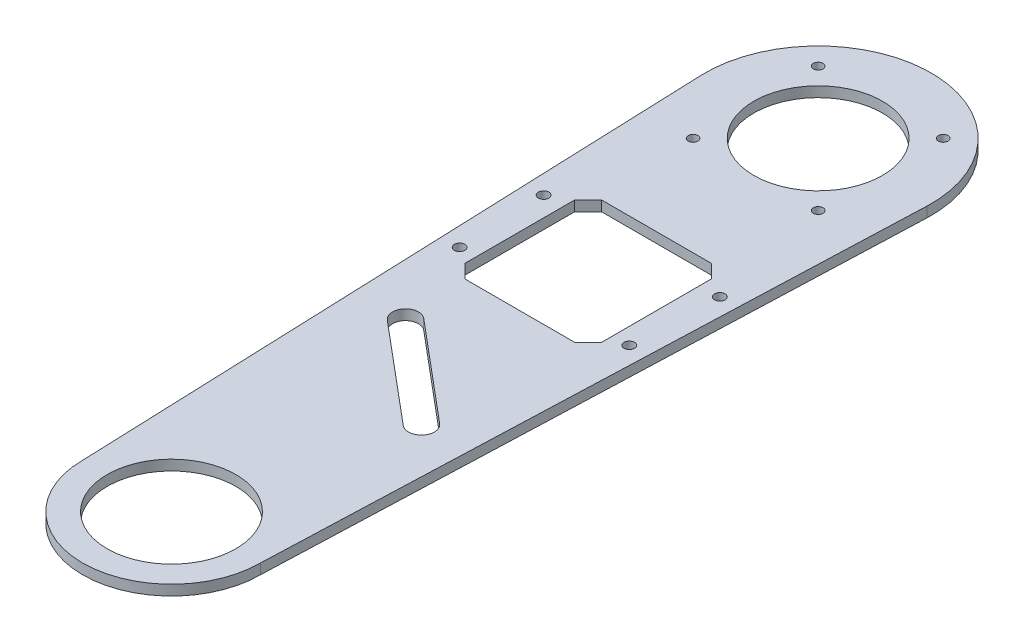
ISO-10303-21;
HEADER;
FILE_DESCRIPTION(('STEP AP214'),'2;1');
FILE_NAME('part.step','',(''),(''),'','','');
FILE_SCHEMA(('AUTOMOTIVE_DESIGN { 1 0 10303 214 1 1 1 1 }'));
ENDSEC;
DATA;
#1=APPLICATION_CONTEXT('core data for automotive mechanical design processes');
#2=APPLICATION_PROTOCOL_DEFINITION('international standard','automotive_design',2000,#1);
#3=PRODUCT_CONTEXT('',#1,'mechanical');
#4=PRODUCT('Part','Part','',(#3));
#5=PRODUCT_RELATED_PRODUCT_CATEGORY('part','',(#4));
#6=PRODUCT_DEFINITION_FORMATION('','',#4);
#7=PRODUCT_DEFINITION_CONTEXT('part definition',#1,'design');
#8=PRODUCT_DEFINITION('design','',#6,#7);
#9=PRODUCT_DEFINITION_SHAPE('','',#8);
#10=(LENGTH_UNIT() NAMED_UNIT(*) SI_UNIT(.MILLI.,.METRE.));
#11=(NAMED_UNIT(*) PLANE_ANGLE_UNIT() SI_UNIT($,.RADIAN.));
#12=(NAMED_UNIT(*) SI_UNIT($,.STERADIAN.) SOLID_ANGLE_UNIT());
#13=UNCERTAINTY_MEASURE_WITH_UNIT(LENGTH_MEASURE(1.E-05),#10,'distance_accuracy_value','');
#14=(GEOMETRIC_REPRESENTATION_CONTEXT(3) GLOBAL_UNCERTAINTY_ASSIGNED_CONTEXT((#13)) GLOBAL_UNIT_ASSIGNED_CONTEXT((#10,
#11,#12)) REPRESENTATION_CONTEXT('',''));
#15=CARTESIAN_POINT('',(0.,0.,0.));
#16=DIRECTION('',(0.,0.,1.));
#17=DIRECTION('',(1.,0.,0.));
#18=AXIS2_PLACEMENT_3D('',#15,#16,#17);
#19=CARTESIAN_POINT('',(31.2181907364059,3.175,1.17454749419578));
#20=DIRECTION('',(-0.999292974733131,0.,-0.0375972159741945));
#21=DIRECTION('',(-0.0375972159741945,0.,0.999292974733131));
#22=AXIS2_PLACEMENT_3D('',#19,#20,#21);
#23=PLANE('',#22);
#24=DIRECTION('',(0.0375972159741945,0.,-0.999292974733131));
#25=VECTOR('',#24,1.);
#26=CARTESIAN_POINT('',(31.2181907364059,0.,1.17454749419578));
#27=LINE('',#26,#25);
#28=CARTESIAN_POINT('',(27.5,0.,100.));
#29=VERTEX_POINT('',#28);
#30=CARTESIAN_POINT('',(34.9752541156596,0.,-98.6840974409032));
#31=VERTEX_POINT('',#30);
#32=EDGE_CURVE('E299',#29,#31,#27,.T.);
#33=ORIENTED_EDGE('',*,*,#32,.T.);
#34=DIRECTION('',(0.,-1.,0.));
#35=VECTOR('',#34,1.);
#36=CARTESIAN_POINT('',(34.9752541156596,3.175,-98.6840974409032));
#37=LINE('',#36,#35);
#38=CARTESIAN_POINT('',(34.9752541156596,3.175,-98.6840974409032));
#39=VERTEX_POINT('',#38);
#40=EDGE_CURVE('E11',#39,#31,#37,.T.);
#41=ORIENTED_EDGE('',*,*,#40,.F.);
#42=DIRECTION('',(0.0375972159741945,0.,-0.999292974733131));
#43=VECTOR('',#42,1.);
#44=CARTESIAN_POINT('',(31.2181907364059,3.175,1.17454749419578));
#45=LINE('',#44,#43);
#46=CARTESIAN_POINT('',(27.5,3.175,100.));
#47=VERTEX_POINT('',#46);
#48=EDGE_CURVE('E308',#47,#39,#45,.T.);
#49=ORIENTED_EDGE('',*,*,#48,.F.);
#50=DIRECTION('',(0.,-1.,0.));
#51=VECTOR('',#50,1.);
#52=CARTESIAN_POINT('',(27.5,3.175,100.));
#53=LINE('',#52,#51);
#54=EDGE_CURVE('E319',#47,#29,#53,.T.);
#55=ORIENTED_EDGE('',*,*,#54,.T.);
#56=EDGE_LOOP('',(#33,#41,#49,#55));
#57=FACE_BOUND('',#56,.T.);
#58=ADVANCED_FACE('F35',(#57),#23,.F.);
#59=CARTESIAN_POINT('',(0.,3.175,-100.));
#60=DIRECTION('',(0.,-1.,0.));
#61=DIRECTION('',(0.,0.,-1.));
#62=AXIS2_PLACEMENT_3D('',#59,#60,#61);
#63=CYLINDRICAL_SURFACE('',#62,35.);
#64=CARTESIAN_POINT('',(0.,0.,-100.));
#65=DIRECTION('',(0.,1.,0.));
#66=DIRECTION('',(0.,0.,1.));
#67=AXIS2_PLACEMENT_3D('',#64,#65,#66);
#68=CIRCLE('',#67,35.);
#69=CARTESIAN_POINT('',(-34.9752541156596,0.,-98.6840974409032));
#70=VERTEX_POINT('',#69);
#71=EDGE_CURVE('E322',#31,#70,#68,.T.);
#72=ORIENTED_EDGE('',*,*,#71,.T.);
#73=DIRECTION('',(0.,-1.,0.));
#74=VECTOR('',#73,1.);
#75=CARTESIAN_POINT('',(-34.9752541156596,3.175,-98.6840974409032));
#76=LINE('',#75,#74);
#77=CARTESIAN_POINT('',(-34.9752541156596,3.175,-98.6840974409032));
#78=VERTEX_POINT('',#77);
#79=EDGE_CURVE('E42',#78,#70,#76,.T.);
#80=ORIENTED_EDGE('',*,*,#79,.F.);
#81=CARTESIAN_POINT('',(0.,3.175,-100.));
#82=DIRECTION('',(0.,1.,0.));
#83=DIRECTION('',(0.,0.,1.));
#84=AXIS2_PLACEMENT_3D('',#81,#82,#83);
#85=CIRCLE('',#84,35.);
#86=EDGE_CURVE('E311',#39,#78,#85,.T.);
#87=ORIENTED_EDGE('',*,*,#86,.F.);
#88=ORIENTED_EDGE('',*,*,#40,.T.);
#89=EDGE_LOOP('',(#72,#80,#87,#88));
#90=FACE_BOUND('',#89,.T.);
#91=ADVANCED_FACE('F338',(#90),#63,.T.);
#92=CARTESIAN_POINT('',(-31.2181907364059,3.175,1.17454749419578));
#93=DIRECTION('',(-0.999292974733131,0.,0.0375972159741945));
#94=DIRECTION('',(0.0375972159741945,0.,0.999292974733131));
#95=AXIS2_PLACEMENT_3D('',#92,#93,#94);
#96=PLANE('',#95);
#97=DIRECTION('',(-0.0375972159741945,0.,-0.999292974733131));
#98=VECTOR('',#97,1.);
#99=CARTESIAN_POINT('',(-31.2181907364059,0.,1.17454749419578));
#100=LINE('',#99,#98);
#101=CARTESIAN_POINT('',(-27.5,0.,100.));
#102=VERTEX_POINT('',#101);
#103=EDGE_CURVE('E325',#102,#70,#100,.T.);
#104=ORIENTED_EDGE('',*,*,#103,.F.);
#105=DIRECTION('',(0.,-1.,0.));
#106=VECTOR('',#105,1.);
#107=CARTESIAN_POINT('',(-27.5,3.175,100.));
#108=LINE('',#107,#106);
#109=CARTESIAN_POINT('',(-27.5,3.175,100.));
#110=VERTEX_POINT('',#109);
#111=EDGE_CURVE('E331',#110,#102,#108,.T.);
#112=ORIENTED_EDGE('',*,*,#111,.F.);
#113=DIRECTION('',(-0.0375972159741945,0.,-0.999292974733131));
#114=VECTOR('',#113,1.);
#115=CARTESIAN_POINT('',(-31.2181907364059,3.175,1.17454749419578));
#116=LINE('',#115,#114);
#117=EDGE_CURVE('E314',#110,#78,#116,.T.);
#118=ORIENTED_EDGE('',*,*,#117,.T.);
#119=ORIENTED_EDGE('',*,*,#79,.T.);
#120=EDGE_LOOP('',(#104,#112,#118,#119));
#121=FACE_BOUND('',#120,.T.);
#122=ADVANCED_FACE('F335',(#121),#96,.T.);
#123=CARTESIAN_POINT('',(0.,3.175,100.));
#124=DIRECTION('',(0.,-1.,0.));
#125=DIRECTION('',(0.,0.,-1.));
#126=AXIS2_PLACEMENT_3D('',#123,#124,#125);
#127=CYLINDRICAL_SURFACE('',#126,27.5);
#128=CARTESIAN_POINT('',(0.,0.,100.));
#129=DIRECTION('',(0.,1.,0.));
#130=DIRECTION('',(0.,0.,1.));
#131=AXIS2_PLACEMENT_3D('',#128,#129,#130);
#132=CIRCLE('',#131,27.5);
#133=EDGE_CURVE('E312',#102,#29,#132,.T.);
#134=ORIENTED_EDGE('',*,*,#133,.T.);
#135=ORIENTED_EDGE('',*,*,#54,.F.);
#136=CARTESIAN_POINT('',(0.,3.175,100.));
#137=DIRECTION('',(0.,1.,0.));
#138=DIRECTION('',(0.,0.,1.));
#139=AXIS2_PLACEMENT_3D('',#136,#137,#138);
#140=CIRCLE('',#139,27.5);
#141=EDGE_CURVE('E317',#110,#47,#140,.T.);
#142=ORIENTED_EDGE('',*,*,#141,.F.);
#143=ORIENTED_EDGE('',*,*,#111,.T.);
#144=EDGE_LOOP('',(#134,#135,#142,#143));
#145=FACE_BOUND('',#144,.T.);
#146=ADVANCED_FACE('F345',(#145),#127,.T.);
#147=CARTESIAN_POINT('',(0.,3.175,0.));
#148=DIRECTION('',(0.,1.,0.));
#149=DIRECTION('',(0.,0.,1.));
#150=AXIS2_PLACEMENT_3D('',#147,#148,#149);
#151=PLANE('',#150);
#152=CARTESIAN_POINT('',(15.3208888623795,3.175,38.0115043874616));
#153=DIRECTION('',(0.,1.,0.));
#154=DIRECTION('',(0.,0.,1.));
#155=AXIS2_PLACEMENT_3D('',#152,#153,#154);
#156=CIRCLE('',#155,3.99999999999999);
#157=CARTESIAN_POINT('',(12.7497384236334,3.175,41.0756821599375));
#158=VERTEX_POINT('',#157);
#159=CARTESIAN_POINT('',(17.8920393011257,3.175,34.9473266149857));
#160=VERTEX_POINT('',#159);
#161=EDGE_CURVE('E49',#158,#160,#156,.T.);
#162=ORIENTED_EDGE('',*,*,#161,.F.);
#163=DIRECTION('',(0.766044443118977,0.,0.642787609686541));
#164=VECTOR('',#163,1.);
#165=CARTESIAN_POINT('',(-17.8920393011257,3.175,15.3641777724759));
#166=LINE('',#165,#164);
#167=CARTESIAN_POINT('',(-17.8920393011257,3.175,15.3641777724759));
#168=VERTEX_POINT('',#167);
#169=EDGE_CURVE('E165',#168,#158,#166,.T.);
#170=ORIENTED_EDGE('',*,*,#169,.F.);
#171=CARTESIAN_POINT('',(-15.3208888623795,3.175,12.2999999999999));
#172=DIRECTION('',(0.,1.,0.));
#173=DIRECTION('',(0.,0.,1.));
#174=AXIS2_PLACEMENT_3D('',#171,#172,#173);
#175=CIRCLE('',#174,3.99999999999999);
#176=CARTESIAN_POINT('',(-12.7497384236334,3.175,9.23582222752405));
#177=VERTEX_POINT('',#176);
#178=EDGE_CURVE('E168',#177,#168,#175,.T.);
#179=ORIENTED_EDGE('',*,*,#178,.F.);
#180=DIRECTION('',(-0.766044443118977,0.,-0.642787609686541));
#181=VECTOR('',#180,1.);
#182=CARTESIAN_POINT('',(17.8920393011257,3.175,34.9473266149857));
#183=LINE('',#182,#181);
#184=EDGE_CURVE('E174',#160,#177,#183,.T.);
#185=ORIENTED_EDGE('',*,*,#184,.F.);
#186=EDGE_LOOP('',(#162,#170,#179,#185));
#187=FACE_BOUND('',#186,.T.);
#188=CARTESIAN_POINT('',(27.2564768235202,3.175,-42.3404551588973));
#189=DIRECTION('',(0.,1.,0.));
#190=DIRECTION('',(0.,0.,1.));
#191=AXIS2_PLACEMENT_3D('',#188,#189,#190);
#192=CIRCLE('',#191,1.62499999999999);
#193=CARTESIAN_POINT('',(27.2564768235202,3.175,-40.7154551588973));
#194=VERTEX_POINT('',#193);
#195=EDGE_CURVE('E180',#194,#194,#192,.T.);
#196=ORIENTED_EDGE('',*,*,#195,.F.);
#197=EDGE_LOOP('',(#196));
#198=FACE_BOUND('',#197,.T.);
#199=CARTESIAN_POINT('',(26.2413519922169,3.175,-15.3595448411027));
#200=DIRECTION('',(0.,1.,0.));
#201=DIRECTION('',(0.,0.,1.));
#202=AXIS2_PLACEMENT_3D('',#199,#200,#201);
#203=CIRCLE('',#202,1.62499999999999);
#204=CARTESIAN_POINT('',(26.2413519922169,3.175,-13.7345448411028));
#205=VERTEX_POINT('',#204);
#206=EDGE_CURVE('E200',#205,#205,#203,.T.);
#207=ORIENTED_EDGE('',*,*,#206,.F.);
#208=EDGE_LOOP('',(#207));
#209=FACE_BOUND('',#208,.T.);
#210=CARTESIAN_POINT('',(-26.2413519922169,3.175,-15.3595448411027));
#211=DIRECTION('',(0.,1.,0.));
#212=DIRECTION('',(0.,0.,1.));
#213=AXIS2_PLACEMENT_3D('',#210,#211,#212);
#214=CIRCLE('',#213,1.62499999999999);
#215=CARTESIAN_POINT('',(-26.2413519922169,3.175,-13.7345448411028));
#216=VERTEX_POINT('',#215);
#217=EDGE_CURVE('E194',#216,#216,#214,.T.);
#218=ORIENTED_EDGE('',*,*,#217,.F.);
#219=EDGE_LOOP('',(#218));
#220=FACE_BOUND('',#219,.T.);
#221=CARTESIAN_POINT('',(-27.2564768235202,3.175,-42.3404551588973));
#222=DIRECTION('',(0.,1.,0.));
#223=DIRECTION('',(0.,0.,1.));
#224=AXIS2_PLACEMENT_3D('',#221,#222,#223);
#225=CIRCLE('',#224,1.625);
#226=CARTESIAN_POINT('',(-27.2564768235202,3.175,-40.7154551588973));
#227=VERTEX_POINT('',#226);
#228=EDGE_CURVE('E188',#227,#227,#225,.T.);
#229=ORIENTED_EDGE('',*,*,#228,.F.);
#230=EDGE_LOOP('',(#229));
#231=FACE_BOUND('',#230,.T.);
#232=DIRECTION('',(0.,0.,1.));
#233=VECTOR('',#232,1.);
#234=CARTESIAN_POINT('',(-21.15,3.175,-11.8719300090006));
#235=LINE('',#234,#233);
#236=CARTESIAN_POINT('',(-21.15,3.175,-45.8280699909994));
#237=VERTEX_POINT('',#236);
#238=CARTESIAN_POINT('',(-21.15,3.175,-11.8719300090006));
#239=VERTEX_POINT('',#238);
#240=EDGE_CURVE('E187',#237,#239,#235,.T.);
#241=ORIENTED_EDGE('',*,*,#240,.F.);
#242=DIRECTION('',(-0.707106781186548,0.,0.707106781186547));
#243=VECTOR('',#242,1.);
#244=CARTESIAN_POINT('',(-21.15,3.175,-45.8280699909994));
#245=LINE('',#244,#243);
#246=CARTESIAN_POINT('',(-16.9780699909994,3.175,-50.));
#247=VERTEX_POINT('',#246);
#248=EDGE_CURVE('E212',#247,#237,#245,.T.);
#249=ORIENTED_EDGE('',*,*,#248,.F.);
#250=DIRECTION('',(-1.,0.,0.));
#251=VECTOR('',#250,1.);
#252=CARTESIAN_POINT('',(-16.9780699909994,3.175,-50.));
#253=LINE('',#252,#251);
#254=CARTESIAN_POINT('',(16.9780699909994,3.175,-50.));
#255=VERTEX_POINT('',#254);
#256=EDGE_CURVE('E250',#255,#247,#253,.T.);
#257=ORIENTED_EDGE('',*,*,#256,.F.);
#258=DIRECTION('',(-0.707106781186548,0.,-0.707106781186547));
#259=VECTOR('',#258,1.);
#260=CARTESIAN_POINT('',(16.9780699909994,3.175,-50.));
#261=LINE('',#260,#259);
#262=CARTESIAN_POINT('',(21.15,3.175,-45.8280699909994));
#263=VERTEX_POINT('',#262);
#264=EDGE_CURVE('E247',#263,#255,#261,.T.);
#265=ORIENTED_EDGE('',*,*,#264,.F.);
#266=DIRECTION('',(0.,0.,-1.));
#267=VECTOR('',#266,1.);
#268=CARTESIAN_POINT('',(21.15,3.175,-45.8280699909994));
#269=LINE('',#268,#267);
#270=CARTESIAN_POINT('',(21.15,3.175,-11.8719300090007));
#271=VERTEX_POINT('',#270);
#272=EDGE_CURVE('E244',#271,#263,#269,.T.);
#273=ORIENTED_EDGE('',*,*,#272,.F.);
#274=DIRECTION('',(0.707106781186547,0.,-0.707106781186548));
#275=VECTOR('',#274,1.);
#276=CARTESIAN_POINT('',(21.15,3.175,-11.8719300090007));
#277=LINE('',#276,#275);
#278=CARTESIAN_POINT('',(16.9780699909994,3.175,-7.70000000000005));
#279=VERTEX_POINT('',#278);
#280=EDGE_CURVE('E241',#279,#271,#277,.T.);
#281=ORIENTED_EDGE('',*,*,#280,.F.);
#282=DIRECTION('',(1.,0.,0.));
#283=VECTOR('',#282,1.);
#284=CARTESIAN_POINT('',(16.9780699909994,3.175,-7.70000000000005));
#285=LINE('',#284,#283);
#286=CARTESIAN_POINT('',(-16.9780699909994,3.175,-7.70000000000005));
#287=VERTEX_POINT('',#286);
#288=EDGE_CURVE('E238',#287,#279,#285,.T.);
#289=ORIENTED_EDGE('',*,*,#288,.F.);
#290=DIRECTION('',(0.707106781186555,0.,0.70710678118654));
#291=VECTOR('',#290,1.);
#292=CARTESIAN_POINT('',(-16.9780699909994,3.175,-7.70000000000005));
#293=LINE('',#292,#291);
#294=EDGE_CURVE('E235',#239,#287,#293,.T.);
#295=ORIENTED_EDGE('',*,*,#294,.F.);
#296=EDGE_LOOP('',(#241,#249,#257,#265,#273,#281,#289,#295));
#297=FACE_BOUND('',#296,.T.);
#298=CARTESIAN_POINT('',(-19.3393704654521,3.175,-80.6606295345479));
#299=DIRECTION('',(0.,1.,0.));
#300=DIRECTION('',(0.,0.,1.));
#301=AXIS2_PLACEMENT_3D('',#298,#299,#300);
#302=CIRCLE('',#301,1.5);
#303=CARTESIAN_POINT('',(-19.3393704654521,3.175,-79.1606295345479));
#304=VERTEX_POINT('',#303);
#305=EDGE_CURVE('E257',#304,#304,#302,.T.);
#306=ORIENTED_EDGE('',*,*,#305,.F.);
#307=EDGE_LOOP('',(#306));
#308=FACE_BOUND('',#307,.T.);
#309=CARTESIAN_POINT('',(-19.3393704654521,3.175,-119.339370465452));
#310=DIRECTION('',(0.,1.,0.));
#311=DIRECTION('',(0.,0.,1.));
#312=AXIS2_PLACEMENT_3D('',#309,#310,#311);
#313=CIRCLE('',#312,1.5);
#314=CARTESIAN_POINT('',(-19.3393704654521,3.175,-117.839370465452));
#315=VERTEX_POINT('',#314);
#316=EDGE_CURVE('E282',#315,#315,#313,.T.);
#317=ORIENTED_EDGE('',*,*,#316,.F.);
#318=EDGE_LOOP('',(#317));
#319=FACE_BOUND('',#318,.T.);
#320=CARTESIAN_POINT('',(19.3393704654521,3.175,-119.339370465452));
#321=DIRECTION('',(0.,1.,0.));
#322=DIRECTION('',(0.,0.,1.));
#323=AXIS2_PLACEMENT_3D('',#320,#321,#322);
#324=CIRCLE('',#323,1.5);
#325=CARTESIAN_POINT('',(19.3393704654521,3.175,-117.839370465452));
#326=VERTEX_POINT('',#325);
#327=EDGE_CURVE('E276',#326,#326,#324,.T.);
#328=ORIENTED_EDGE('',*,*,#327,.F.);
#329=EDGE_LOOP('',(#328));
#330=FACE_BOUND('',#329,.T.);
#331=CARTESIAN_POINT('',(19.3393704654521,3.175,-80.6606295345479));
#332=DIRECTION('',(0.,1.,0.));
#333=DIRECTION('',(0.,0.,1.));
#334=AXIS2_PLACEMENT_3D('',#331,#332,#333);
#335=CIRCLE('',#334,1.5);
#336=CARTESIAN_POINT('',(19.3393704654521,3.175,-79.1606295345479));
#337=VERTEX_POINT('',#336);
#338=EDGE_CURVE('E275',#337,#337,#335,.T.);
#339=ORIENTED_EDGE('',*,*,#338,.F.);
#340=EDGE_LOOP('',(#339));
#341=FACE_BOUND('',#340,.T.);
#342=CARTESIAN_POINT('',(0.,3.175,100.));
#343=DIRECTION('',(0.,1.,0.));
#344=DIRECTION('',(0.,0.,1.));
#345=AXIS2_PLACEMENT_3D('',#342,#343,#344);
#346=CIRCLE('',#345,19.9);
#347=CARTESIAN_POINT('',(0.,3.175,119.9));
#348=VERTEX_POINT('',#347);
#349=EDGE_CURVE('E300',#348,#348,#346,.T.);
#350=ORIENTED_EDGE('',*,*,#349,.F.);
#351=EDGE_LOOP('',(#350));
#352=FACE_BOUND('',#351,.T.);
#353=CARTESIAN_POINT('',(0.,3.175,-100.));
#354=DIRECTION('',(0.,1.,0.));
#355=DIRECTION('',(0.,0.,1.));
#356=AXIS2_PLACEMENT_3D('',#353,#354,#355);
#357=CIRCLE('',#356,19.9);
#358=CARTESIAN_POINT('',(0.,3.175,-80.1));
#359=VERTEX_POINT('',#358);
#360=EDGE_CURVE('E293',#359,#359,#357,.T.);
#361=ORIENTED_EDGE('',*,*,#360,.F.);
#362=EDGE_LOOP('',(#361));
#363=FACE_BOUND('',#362,.T.);
#364=ORIENTED_EDGE('',*,*,#48,.T.);
#365=ORIENTED_EDGE('',*,*,#86,.T.);
#366=ORIENTED_EDGE('',*,*,#117,.F.);
#367=ORIENTED_EDGE('',*,*,#141,.T.);
#368=EDGE_LOOP('',(#364,#365,#366,#367));
#369=FACE_BOUND('',#368,.T.);
#370=ADVANCED_FACE('F350',(#187,#198,#209,#220,#231,#297,#308,#319,#330,#341,#352,#363,#369),
#151,.T.);
#371=CARTESIAN_POINT('',(0.,0.,0.));
#372=DIRECTION('',(0.,1.,0.));
#373=DIRECTION('',(0.,0.,1.));
#374=AXIS2_PLACEMENT_3D('',#371,#372,#373);
#375=PLANE('',#374);
#376=DIRECTION('',(0.766044443118977,0.,0.642787609686541));
#377=VECTOR('',#376,1.);
#378=CARTESIAN_POINT('',(-17.8920393011257,0.,15.3641777724759));
#379=LINE('',#378,#377);
#380=CARTESIAN_POINT('',(-17.8920393011257,0.,15.3641777724759));
#381=VERTEX_POINT('',#380);
#382=CARTESIAN_POINT('',(12.7497384236334,0.,41.0756821599375));
#383=VERTEX_POINT('',#382);
#384=EDGE_CURVE('E155',#381,#383,#379,.T.);
#385=ORIENTED_EDGE('',*,*,#384,.T.);
#386=CARTESIAN_POINT('',(15.3208888623795,0.,38.0115043874616));
#387=DIRECTION('',(0.,1.,0.));
#388=DIRECTION('',(0.,0.,1.));
#389=AXIS2_PLACEMENT_3D('',#386,#387,#388);
#390=CIRCLE('',#389,3.99999999999999);
#391=CARTESIAN_POINT('',(17.8920393011257,0.,34.9473266149857));
#392=VERTEX_POINT('',#391);
#393=EDGE_CURVE('E149',#383,#392,#390,.T.);
#394=ORIENTED_EDGE('',*,*,#393,.T.);
#395=DIRECTION('',(-0.766044443118977,0.,-0.642787609686541));
#396=VECTOR('',#395,1.);
#397=CARTESIAN_POINT('',(17.8920393011257,0.,34.9473266149857));
#398=LINE('',#397,#396);
#399=CARTESIAN_POINT('',(-12.7497384236334,0.,9.23582222752404));
#400=VERTEX_POINT('',#399);
#401=EDGE_CURVE('E158',#392,#400,#398,.T.);
#402=ORIENTED_EDGE('',*,*,#401,.T.);
#403=CARTESIAN_POINT('',(-15.3208888623795,0.,12.2999999999999));
#404=DIRECTION('',(0.,1.,0.));
#405=DIRECTION('',(0.,0.,1.));
#406=AXIS2_PLACEMENT_3D('',#403,#404,#405);
#407=CIRCLE('',#406,3.99999999999999);
#408=EDGE_CURVE('E57',#400,#381,#407,.T.);
#409=ORIENTED_EDGE('',*,*,#408,.T.);
#410=EDGE_LOOP('',(#385,#394,#402,#409));
#411=FACE_BOUND('',#410,.T.);
#412=CARTESIAN_POINT('',(27.2564768235202,0.,-42.3404551588973));
#413=DIRECTION('',(0.,1.,0.));
#414=DIRECTION('',(0.,0.,1.));
#415=AXIS2_PLACEMENT_3D('',#412,#413,#414);
#416=CIRCLE('',#415,1.62499999999999);
#417=CARTESIAN_POINT('',(27.2564768235202,0.,-40.7154551588973));
#418=VERTEX_POINT('',#417);
#419=EDGE_CURVE('E203',#418,#418,#416,.T.);
#420=ORIENTED_EDGE('',*,*,#419,.T.);
#421=EDGE_LOOP('',(#420));
#422=FACE_BOUND('',#421,.T.);
#423=CARTESIAN_POINT('',(26.2413519922169,0.,-15.3595448411027));
#424=DIRECTION('',(0.,1.,0.));
#425=DIRECTION('',(0.,0.,1.));
#426=AXIS2_PLACEMENT_3D('',#423,#424,#425);
#427=CIRCLE('',#426,1.62499999999999);
#428=CARTESIAN_POINT('',(26.2413519922169,0.,-13.7345448411028));
#429=VERTEX_POINT('',#428);
#430=EDGE_CURVE('E197',#429,#429,#427,.T.);
#431=ORIENTED_EDGE('',*,*,#430,.T.);
#432=EDGE_LOOP('',(#431));
#433=FACE_BOUND('',#432,.T.);
#434=CARTESIAN_POINT('',(-26.2413519922169,0.,-15.3595448411027));
#435=DIRECTION('',(0.,1.,0.));
#436=DIRECTION('',(0.,0.,1.));
#437=AXIS2_PLACEMENT_3D('',#434,#435,#436);
#438=CIRCLE('',#437,1.62499999999999);
#439=CARTESIAN_POINT('',(-26.2413519922169,0.,-13.7345448411028));
#440=VERTEX_POINT('',#439);
#441=EDGE_CURVE('E191',#440,#440,#438,.T.);
#442=ORIENTED_EDGE('',*,*,#441,.T.);
#443=EDGE_LOOP('',(#442));
#444=FACE_BOUND('',#443,.T.);
#445=CARTESIAN_POINT('',(-27.2564768235202,0.,-42.3404551588973));
#446=DIRECTION('',(0.,1.,0.));
#447=DIRECTION('',(0.,0.,1.));
#448=AXIS2_PLACEMENT_3D('',#445,#446,#447);
#449=CIRCLE('',#448,1.625);
#450=CARTESIAN_POINT('',(-27.2564768235202,0.,-40.7154551588973));
#451=VERTEX_POINT('',#450);
#452=EDGE_CURVE('E184',#451,#451,#449,.T.);
#453=ORIENTED_EDGE('',*,*,#452,.T.);
#454=EDGE_LOOP('',(#453));
#455=FACE_BOUND('',#454,.T.);
#456=DIRECTION('',(-0.707106781186548,0.,0.707106781186547));
#457=VECTOR('',#456,1.);
#458=CARTESIAN_POINT('',(-21.15,0.,-45.8280699909994));
#459=LINE('',#458,#457);
#460=CARTESIAN_POINT('',(-16.9780699909994,0.,-50.));
#461=VERTEX_POINT('',#460);
#462=CARTESIAN_POINT('',(-21.15,0.,-45.8280699909994));
#463=VERTEX_POINT('',#462);
#464=EDGE_CURVE('E230',#461,#463,#459,.T.);
#465=ORIENTED_EDGE('',*,*,#464,.T.);
#466=DIRECTION('',(0.,0.,1.));
#467=VECTOR('',#466,1.);
#468=CARTESIAN_POINT('',(-21.15,0.,-11.8719300090006));
#469=LINE('',#468,#467);
#470=CARTESIAN_POINT('',(-21.15,0.,-11.8719300090006));
#471=VERTEX_POINT('',#470);
#472=EDGE_CURVE('E208',#463,#471,#469,.T.);
#473=ORIENTED_EDGE('',*,*,#472,.T.);
#474=DIRECTION('',(0.707106781186555,0.,0.70710678118654));
#475=VECTOR('',#474,1.);
#476=CARTESIAN_POINT('',(-16.9780699909994,0.,-7.70000000000005));
#477=LINE('',#476,#475);
#478=CARTESIAN_POINT('',(-16.9780699909994,0.,-7.70000000000006));
#479=VERTEX_POINT('',#478);
#480=EDGE_CURVE('E211',#471,#479,#477,.T.);
#481=ORIENTED_EDGE('',*,*,#480,.T.);
#482=DIRECTION('',(1.,0.,0.));
#483=VECTOR('',#482,1.);
#484=CARTESIAN_POINT('',(16.9780699909994,0.,-7.70000000000005));
#485=LINE('',#484,#483);
#486=CARTESIAN_POINT('',(16.9780699909994,0.,-7.70000000000005));
#487=VERTEX_POINT('',#486);
#488=EDGE_CURVE('E215',#479,#487,#485,.T.);
#489=ORIENTED_EDGE('',*,*,#488,.T.);
#490=DIRECTION('',(0.707106781186547,0.,-0.707106781186548));
#491=VECTOR('',#490,1.);
#492=CARTESIAN_POINT('',(21.15,0.,-11.8719300090007));
#493=LINE('',#492,#491);
#494=CARTESIAN_POINT('',(21.15,0.,-11.8719300090007));
#495=VERTEX_POINT('',#494);
#496=EDGE_CURVE('E218',#487,#495,#493,.T.);
#497=ORIENTED_EDGE('',*,*,#496,.T.);
#498=DIRECTION('',(0.,0.,-1.));
#499=VECTOR('',#498,1.);
#500=CARTESIAN_POINT('',(21.15,0.,-45.8280699909994));
#501=LINE('',#500,#499);
#502=CARTESIAN_POINT('',(21.15,0.,-45.8280699909994));
#503=VERTEX_POINT('',#502);
#504=EDGE_CURVE('E221',#495,#503,#501,.T.);
#505=ORIENTED_EDGE('',*,*,#504,.T.);
#506=DIRECTION('',(-0.707106781186548,0.,-0.707106781186547));
#507=VECTOR('',#506,1.);
#508=CARTESIAN_POINT('',(16.9780699909994,0.,-50.));
#509=LINE('',#508,#507);
#510=CARTESIAN_POINT('',(16.9780699909994,0.,-50.));
#511=VERTEX_POINT('',#510);
#512=EDGE_CURVE('E224',#503,#511,#509,.T.);
#513=ORIENTED_EDGE('',*,*,#512,.T.);
#514=DIRECTION('',(-1.,0.,0.));
#515=VECTOR('',#514,1.);
#516=CARTESIAN_POINT('',(-16.9780699909994,0.,-50.));
#517=LINE('',#516,#515);
#518=EDGE_CURVE('E227',#511,#461,#517,.T.);
#519=ORIENTED_EDGE('',*,*,#518,.T.);
#520=EDGE_LOOP('',(#465,#473,#481,#489,#497,#505,#513,#519));
#521=FACE_BOUND('',#520,.T.);
#522=CARTESIAN_POINT('',(-19.3393704654521,0.,-80.6606295345479));
#523=DIRECTION('',(0.,1.,0.));
#524=DIRECTION('',(0.,0.,1.));
#525=AXIS2_PLACEMENT_3D('',#522,#523,#524);
#526=CIRCLE('',#525,1.5);
#527=CARTESIAN_POINT('',(-19.3393704654521,0.,-79.1606295345479));
#528=VERTEX_POINT('',#527);
#529=EDGE_CURVE('E285',#528,#528,#526,.T.);
#530=ORIENTED_EDGE('',*,*,#529,.T.);
#531=EDGE_LOOP('',(#530));
#532=FACE_BOUND('',#531,.T.);
#533=CARTESIAN_POINT('',(-19.3393704654521,0.,-119.339370465452));
#534=DIRECTION('',(0.,1.,0.));
#535=DIRECTION('',(0.,0.,1.));
#536=AXIS2_PLACEMENT_3D('',#533,#534,#535);
#537=CIRCLE('',#536,1.5);
#538=CARTESIAN_POINT('',(-19.3393704654521,0.,-117.839370465452));
#539=VERTEX_POINT('',#538);
#540=EDGE_CURVE('E279',#539,#539,#537,.T.);
#541=ORIENTED_EDGE('',*,*,#540,.T.);
#542=EDGE_LOOP('',(#541));
#543=FACE_BOUND('',#542,.T.);
#544=CARTESIAN_POINT('',(19.3393704654521,0.,-119.339370465452));
#545=DIRECTION('',(0.,1.,0.));
#546=DIRECTION('',(0.,0.,1.));
#547=AXIS2_PLACEMENT_3D('',#544,#545,#546);
#548=CIRCLE('',#547,1.5);
#549=CARTESIAN_POINT('',(19.3393704654521,0.,-117.839370465452));
#550=VERTEX_POINT('',#549);
#551=EDGE_CURVE('E272',#550,#550,#548,.T.);
#552=ORIENTED_EDGE('',*,*,#551,.T.);
#553=EDGE_LOOP('',(#552));
#554=FACE_BOUND('',#553,.T.);
#555=CARTESIAN_POINT('',(19.3393704654521,0.,-80.6606295345479));
#556=DIRECTION('',(0.,1.,0.));
#557=DIRECTION('',(0.,0.,1.));
#558=AXIS2_PLACEMENT_3D('',#555,#556,#557);
#559=CIRCLE('',#558,1.5);
#560=CARTESIAN_POINT('',(19.3393704654521,0.,-79.1606295345479));
#561=VERTEX_POINT('',#560);
#562=EDGE_CURVE('E290',#561,#561,#559,.T.);
#563=ORIENTED_EDGE('',*,*,#562,.T.);
#564=EDGE_LOOP('',(#563));
#565=FACE_BOUND('',#564,.T.);
#566=CARTESIAN_POINT('',(0.,0.,100.));
#567=DIRECTION('',(0.,1.,0.));
#568=DIRECTION('',(0.,0.,1.));
#569=AXIS2_PLACEMENT_3D('',#566,#567,#568);
#570=CIRCLE('',#569,19.9);
#571=CARTESIAN_POINT('',(0.,0.,119.9));
#572=VERTEX_POINT('',#571);
#573=EDGE_CURVE('E296',#572,#572,#570,.T.);
#574=ORIENTED_EDGE('',*,*,#573,.T.);
#575=EDGE_LOOP('',(#574));
#576=FACE_BOUND('',#575,.T.);
#577=CARTESIAN_POINT('',(0.,0.,-100.));
#578=DIRECTION('',(0.,1.,0.));
#579=DIRECTION('',(0.,0.,1.));
#580=AXIS2_PLACEMENT_3D('',#577,#578,#579);
#581=CIRCLE('',#580,19.9);
#582=CARTESIAN_POINT('',(0.,0.,-80.1));
#583=VERTEX_POINT('',#582);
#584=EDGE_CURVE('E303',#583,#583,#581,.T.);
#585=ORIENTED_EDGE('',*,*,#584,.T.);
#586=EDGE_LOOP('',(#585));
#587=FACE_BOUND('',#586,.T.);
#588=ORIENTED_EDGE('',*,*,#32,.F.);
#589=ORIENTED_EDGE('',*,*,#133,.F.);
#590=ORIENTED_EDGE('',*,*,#103,.T.);
#591=ORIENTED_EDGE('',*,*,#71,.F.);
#592=EDGE_LOOP('',(#588,#589,#590,#591));
#593=FACE_BOUND('',#592,.T.);
#594=ADVANCED_FACE('F162',(#411,#422,#433,#444,#455,#521,#532,#543,#554,#565,#576,#587,#593),
#375,.F.);
#595=CARTESIAN_POINT('',(0.,0.,-100.));
#596=DIRECTION('',(0.,1.,0.));
#597=DIRECTION('',(0.,0.,1.));
#598=AXIS2_PLACEMENT_3D('',#595,#596,#597);
#599=CYLINDRICAL_SURFACE('',#598,19.9);
#600=ORIENTED_EDGE('',*,*,#584,.F.);
#601=EDGE_LOOP('',(#600));
#602=FACE_BOUND('',#601,.T.);
#603=ORIENTED_EDGE('',*,*,#360,.T.);
#604=EDGE_LOOP('',(#603));
#605=FACE_BOUND('',#604,.T.);
#606=ADVANCED_FACE('F358',(#602,#605),#599,.F.);
#607=CARTESIAN_POINT('',(0.,0.,100.));
#608=DIRECTION('',(0.,1.,0.));
#609=DIRECTION('',(0.,0.,1.));
#610=AXIS2_PLACEMENT_3D('',#607,#608,#609);
#611=CYLINDRICAL_SURFACE('',#610,19.9);
#612=ORIENTED_EDGE('',*,*,#573,.F.);
#613=EDGE_LOOP('',(#612));
#614=FACE_BOUND('',#613,.T.);
#615=ORIENTED_EDGE('',*,*,#349,.T.);
#616=EDGE_LOOP('',(#615));
#617=FACE_BOUND('',#616,.T.);
#618=ADVANCED_FACE('F387',(#614,#617),#611,.F.);
#619=CARTESIAN_POINT('',(19.3393704654521,0.,-80.6606295345479));
#620=DIRECTION('',(0.,1.,0.));
#621=DIRECTION('',(0.,0.,1.));
#622=AXIS2_PLACEMENT_3D('',#619,#620,#621);
#623=CYLINDRICAL_SURFACE('',#622,1.5);
#624=ORIENTED_EDGE('',*,*,#562,.F.);
#625=EDGE_LOOP('',(#624));
#626=FACE_BOUND('',#625,.T.);
#627=ORIENTED_EDGE('',*,*,#338,.T.);
#628=EDGE_LOOP('',(#627));
#629=FACE_BOUND('',#628,.T.);
#630=ADVANCED_FACE('F397',(#626,#629),#623,.F.);
#631=CARTESIAN_POINT('',(19.3393704654521,0.,-119.339370465452));
#632=DIRECTION('',(0.,1.,0.));
#633=DIRECTION('',(0.,0.,1.));
#634=AXIS2_PLACEMENT_3D('',#631,#632,#633);
#635=CYLINDRICAL_SURFACE('',#634,1.5);
#636=ORIENTED_EDGE('',*,*,#551,.F.);
#637=EDGE_LOOP('',(#636));
#638=FACE_BOUND('',#637,.T.);
#639=ORIENTED_EDGE('',*,*,#327,.T.);
#640=EDGE_LOOP('',(#639));
#641=FACE_BOUND('',#640,.T.);
#642=ADVANCED_FACE('F407',(#638,#641),#635,.F.);
#643=CARTESIAN_POINT('',(-19.3393704654521,0.,-119.339370465452));
#644=DIRECTION('',(0.,1.,0.));
#645=DIRECTION('',(0.,0.,1.));
#646=AXIS2_PLACEMENT_3D('',#643,#644,#645);
#647=CYLINDRICAL_SURFACE('',#646,1.5);
#648=ORIENTED_EDGE('',*,*,#540,.F.);
#649=EDGE_LOOP('',(#648));
#650=FACE_BOUND('',#649,.T.);
#651=ORIENTED_EDGE('',*,*,#316,.T.);
#652=EDGE_LOOP('',(#651));
#653=FACE_BOUND('',#652,.T.);
#654=ADVANCED_FACE('F417',(#650,#653),#647,.F.);
#655=CARTESIAN_POINT('',(-19.3393704654521,0.,-80.6606295345479));
#656=DIRECTION('',(0.,1.,0.));
#657=DIRECTION('',(0.,0.,1.));
#658=AXIS2_PLACEMENT_3D('',#655,#656,#657);
#659=CYLINDRICAL_SURFACE('',#658,1.5);
#660=ORIENTED_EDGE('',*,*,#529,.F.);
#661=EDGE_LOOP('',(#660));
#662=FACE_BOUND('',#661,.T.);
#663=ORIENTED_EDGE('',*,*,#305,.T.);
#664=EDGE_LOOP('',(#663));
#665=FACE_BOUND('',#664,.T.);
#666=ADVANCED_FACE('F427',(#662,#665),#659,.F.);
#667=CARTESIAN_POINT('',(-21.15,0.,-11.8719300090006));
#668=DIRECTION('',(-1.,0.,0.));
#669=DIRECTION('',(0.,0.,1.));
#670=AXIS2_PLACEMENT_3D('',#667,#668,#669);
#671=PLANE('',#670);
#672=ORIENTED_EDGE('',*,*,#240,.T.);
#673=DIRECTION('',(0.,1.,0.));
#674=VECTOR('',#673,1.);
#675=CARTESIAN_POINT('',(-21.15,0.,-11.8719300090006));
#676=LINE('',#675,#674);
#677=EDGE_CURVE('E233',#471,#239,#676,.T.);
#678=ORIENTED_EDGE('',*,*,#677,.F.);
#679=ORIENTED_EDGE('',*,*,#472,.F.);
#680=DIRECTION('',(0.,1.,0.));
#681=VECTOR('',#680,1.);
#682=CARTESIAN_POINT('',(-21.15,0.,-45.8280699909994));
#683=LINE('',#682,#681);
#684=EDGE_CURVE('E255',#463,#237,#683,.T.);
#685=ORIENTED_EDGE('',*,*,#684,.T.);
#686=EDGE_LOOP('',(#672,#678,#679,#685));
#687=FACE_BOUND('',#686,.T.);
#688=ADVANCED_FACE('F437',(#687),#671,.F.);
#689=CARTESIAN_POINT('',(-21.15,0.,-45.8280699909994));
#690=DIRECTION('',(-0.707106781186547,0.,-0.707106781186548));
#691=DIRECTION('',(-0.707106781186548,0.,0.707106781186547));
#692=AXIS2_PLACEMENT_3D('',#689,#690,#691);
#693=PLANE('',#692);
#694=ORIENTED_EDGE('',*,*,#248,.T.);
#695=ORIENTED_EDGE('',*,*,#684,.F.);
#696=ORIENTED_EDGE('',*,*,#464,.F.);
#697=DIRECTION('',(0.,1.,0.));
#698=VECTOR('',#697,1.);
#699=CARTESIAN_POINT('',(-16.9780699909994,0.,-50.));
#700=LINE('',#699,#698);
#701=EDGE_CURVE('E258',#461,#247,#700,.T.);
#702=ORIENTED_EDGE('',*,*,#701,.T.);
#703=EDGE_LOOP('',(#694,#695,#696,#702));
#704=FACE_BOUND('',#703,.T.);
#705=ADVANCED_FACE('F447',(#704),#693,.F.);
#706=CARTESIAN_POINT('',(-16.9780699909994,0.,-50.));
#707=DIRECTION('',(0.,0.,-1.));
#708=DIRECTION('',(-1.,0.,0.));
#709=AXIS2_PLACEMENT_3D('',#706,#707,#708);
#710=PLANE('',#709);
#711=ORIENTED_EDGE('',*,*,#256,.T.);
#712=ORIENTED_EDGE('',*,*,#701,.F.);
#713=ORIENTED_EDGE('',*,*,#518,.F.);
#714=DIRECTION('',(0.,1.,0.));
#715=VECTOR('',#714,1.);
#716=CARTESIAN_POINT('',(16.9780699909994,0.,-50.));
#717=LINE('',#716,#715);
#718=EDGE_CURVE('E260',#511,#255,#717,.T.);
#719=ORIENTED_EDGE('',*,*,#718,.T.);
#720=EDGE_LOOP('',(#711,#712,#713,#719));
#721=FACE_BOUND('',#720,.T.);
#722=ADVANCED_FACE('F457',(#721),#710,.F.);
#723=CARTESIAN_POINT('',(16.9780699909994,0.,-50.));
#724=DIRECTION('',(0.707106781186547,0.,-0.707106781186548));
#725=DIRECTION('',(-0.707106781186548,0.,-0.707106781186547));
#726=AXIS2_PLACEMENT_3D('',#723,#724,#725);
#727=PLANE('',#726);
#728=ORIENTED_EDGE('',*,*,#264,.T.);
#729=ORIENTED_EDGE('',*,*,#718,.F.);
#730=ORIENTED_EDGE('',*,*,#512,.F.);
#731=DIRECTION('',(0.,1.,0.));
#732=VECTOR('',#731,1.);
#733=CARTESIAN_POINT('',(21.15,0.,-45.8280699909994));
#734=LINE('',#733,#732);
#735=EDGE_CURVE('E262',#503,#263,#734,.T.);
#736=ORIENTED_EDGE('',*,*,#735,.T.);
#737=EDGE_LOOP('',(#728,#729,#730,#736));
#738=FACE_BOUND('',#737,.T.);
#739=ADVANCED_FACE('F467',(#738),#727,.F.);
#740=CARTESIAN_POINT('',(21.15,0.,-45.8280699909994));
#741=DIRECTION('',(1.,0.,0.));
#742=DIRECTION('',(0.,0.,-1.));
#743=AXIS2_PLACEMENT_3D('',#740,#741,#742);
#744=PLANE('',#743);
#745=ORIENTED_EDGE('',*,*,#272,.T.);
#746=ORIENTED_EDGE('',*,*,#735,.F.);
#747=ORIENTED_EDGE('',*,*,#504,.F.);
#748=DIRECTION('',(0.,1.,0.));
#749=VECTOR('',#748,1.);
#750=CARTESIAN_POINT('',(21.15,0.,-11.8719300090007));
#751=LINE('',#750,#749);
#752=EDGE_CURVE('E264',#495,#271,#751,.T.);
#753=ORIENTED_EDGE('',*,*,#752,.T.);
#754=EDGE_LOOP('',(#745,#746,#747,#753));
#755=FACE_BOUND('',#754,.T.);
#756=ADVANCED_FACE('F477',(#755),#744,.F.);
#757=CARTESIAN_POINT('',(21.15,0.,-11.8719300090007));
#758=DIRECTION('',(0.707106781186548,0.,0.707106781186547));
#759=DIRECTION('',(0.707106781186547,0.,-0.707106781186548));
#760=AXIS2_PLACEMENT_3D('',#757,#758,#759);
#761=PLANE('',#760);
#762=ORIENTED_EDGE('',*,*,#280,.T.);
#763=ORIENTED_EDGE('',*,*,#752,.F.);
#764=ORIENTED_EDGE('',*,*,#496,.F.);
#765=DIRECTION('',(0.,1.,0.));
#766=VECTOR('',#765,1.);
#767=CARTESIAN_POINT('',(16.9780699909994,0.,-7.70000000000005));
#768=LINE('',#767,#766);
#769=EDGE_CURVE('E266',#487,#279,#768,.T.);
#770=ORIENTED_EDGE('',*,*,#769,.T.);
#771=EDGE_LOOP('',(#762,#763,#764,#770));
#772=FACE_BOUND('',#771,.T.);
#773=ADVANCED_FACE('F487',(#772),#761,.F.);
#774=CARTESIAN_POINT('',(16.9780699909994,0.,-7.70000000000005));
#775=DIRECTION('',(0.,0.,1.));
#776=DIRECTION('',(1.,0.,0.));
#777=AXIS2_PLACEMENT_3D('',#774,#775,#776);
#778=PLANE('',#777);
#779=ORIENTED_EDGE('',*,*,#288,.T.);
#780=ORIENTED_EDGE('',*,*,#769,.F.);
#781=ORIENTED_EDGE('',*,*,#488,.F.);
#782=DIRECTION('',(0.,1.,0.));
#783=VECTOR('',#782,1.);
#784=CARTESIAN_POINT('',(-16.9780699909994,0.,-7.70000000000005));
#785=LINE('',#784,#783);
#786=EDGE_CURVE('E268',#479,#287,#785,.T.);
#787=ORIENTED_EDGE('',*,*,#786,.T.);
#788=EDGE_LOOP('',(#779,#780,#781,#787));
#789=FACE_BOUND('',#788,.T.);
#790=ADVANCED_FACE('F497',(#789),#778,.F.);
#791=CARTESIAN_POINT('',(-16.9780699909994,0.,-7.70000000000005));
#792=DIRECTION('',(-0.70710678118654,0.,0.707106781186555));
#793=DIRECTION('',(0.707106781186555,0.,0.70710678118654));
#794=AXIS2_PLACEMENT_3D('',#791,#792,#793);
#795=PLANE('',#794);
#796=ORIENTED_EDGE('',*,*,#294,.T.);
#797=ORIENTED_EDGE('',*,*,#786,.F.);
#798=ORIENTED_EDGE('',*,*,#480,.F.);
#799=ORIENTED_EDGE('',*,*,#677,.T.);
#800=EDGE_LOOP('',(#796,#797,#798,#799));
#801=FACE_BOUND('',#800,.T.);
#802=ADVANCED_FACE('F507',(#801),#795,.F.);
#803=CARTESIAN_POINT('',(-27.2564768235202,0.,-42.3404551588973));
#804=DIRECTION('',(0.,1.,0.));
#805=DIRECTION('',(0.,0.,1.));
#806=AXIS2_PLACEMENT_3D('',#803,#804,#805);
#807=CYLINDRICAL_SURFACE('',#806,1.625);
#808=ORIENTED_EDGE('',*,*,#452,.F.);
#809=EDGE_LOOP('',(#808));
#810=FACE_BOUND('',#809,.T.);
#811=ORIENTED_EDGE('',*,*,#228,.T.);
#812=EDGE_LOOP('',(#811));
#813=FACE_BOUND('',#812,.T.);
#814=ADVANCED_FACE('F517',(#810,#813),#807,.F.);
#815=CARTESIAN_POINT('',(-26.2413519922169,0.,-15.3595448411027));
#816=DIRECTION('',(0.,1.,0.));
#817=DIRECTION('',(0.,0.,1.));
#818=AXIS2_PLACEMENT_3D('',#815,#816,#817);
#819=CYLINDRICAL_SURFACE('',#818,1.62499999999999);
#820=ORIENTED_EDGE('',*,*,#441,.F.);
#821=EDGE_LOOP('',(#820));
#822=FACE_BOUND('',#821,.T.);
#823=ORIENTED_EDGE('',*,*,#217,.T.);
#824=EDGE_LOOP('',(#823));
#825=FACE_BOUND('',#824,.T.);
#826=ADVANCED_FACE('F527',(#822,#825),#819,.F.);
#827=CARTESIAN_POINT('',(26.2413519922169,0.,-15.3595448411027));
#828=DIRECTION('',(0.,1.,0.));
#829=DIRECTION('',(0.,0.,1.));
#830=AXIS2_PLACEMENT_3D('',#827,#828,#829);
#831=CYLINDRICAL_SURFACE('',#830,1.62499999999999);
#832=ORIENTED_EDGE('',*,*,#430,.F.);
#833=EDGE_LOOP('',(#832));
#834=FACE_BOUND('',#833,.T.);
#835=ORIENTED_EDGE('',*,*,#206,.T.);
#836=EDGE_LOOP('',(#835));
#837=FACE_BOUND('',#836,.T.);
#838=ADVANCED_FACE('F537',(#834,#837),#831,.F.);
#839=CARTESIAN_POINT('',(27.2564768235202,0.,-42.3404551588973));
#840=DIRECTION('',(0.,1.,0.));
#841=DIRECTION('',(0.,0.,1.));
#842=AXIS2_PLACEMENT_3D('',#839,#840,#841);
#843=CYLINDRICAL_SURFACE('',#842,1.62499999999999);
#844=ORIENTED_EDGE('',*,*,#419,.F.);
#845=EDGE_LOOP('',(#844));
#846=FACE_BOUND('',#845,.T.);
#847=ORIENTED_EDGE('',*,*,#195,.T.);
#848=EDGE_LOOP('',(#847));
#849=FACE_BOUND('',#848,.T.);
#850=ADVANCED_FACE('F547',(#846,#849),#843,.F.);
#851=CARTESIAN_POINT('',(15.3208888623795,0.,38.0115043874616));
#852=DIRECTION('',(0.,1.,0.));
#853=DIRECTION('',(0.,0.,1.));
#854=AXIS2_PLACEMENT_3D('',#851,#852,#853);
#855=CYLINDRICAL_SURFACE('',#854,3.99999999999999);
#856=ORIENTED_EDGE('',*,*,#161,.T.);
#857=DIRECTION('',(0.,1.,0.));
#858=VECTOR('',#857,1.);
#859=CARTESIAN_POINT('',(17.8920393011257,0.,34.9473266149857));
#860=LINE('',#859,#858);
#861=EDGE_CURVE('E145',#392,#160,#860,.T.);
#862=ORIENTED_EDGE('',*,*,#861,.F.);
#863=ORIENTED_EDGE('',*,*,#393,.F.);
#864=DIRECTION('',(0.,1.,0.));
#865=VECTOR('',#864,1.);
#866=CARTESIAN_POINT('',(12.7497384236334,0.,41.0756821599375));
#867=LINE('',#866,#865);
#868=EDGE_CURVE('E178',#383,#158,#867,.T.);
#869=ORIENTED_EDGE('',*,*,#868,.T.);
#870=EDGE_LOOP('',(#856,#862,#863,#869));
#871=FACE_BOUND('',#870,.T.);
#872=ADVANCED_FACE('F147',(#871),#855,.F.);
#873=CARTESIAN_POINT('',(-17.8920393011257,0.,15.3641777724759));
#874=DIRECTION('',(-0.642787609686541,0.,0.766044443118977));
#875=DIRECTION('',(0.766044443118977,0.,0.642787609686541));
#876=AXIS2_PLACEMENT_3D('',#873,#874,#875);
#877=PLANE('',#876);
#878=ORIENTED_EDGE('',*,*,#169,.T.);
#879=ORIENTED_EDGE('',*,*,#868,.F.);
#880=ORIENTED_EDGE('',*,*,#384,.F.);
#881=DIRECTION('',(0.,1.,0.));
#882=VECTOR('',#881,1.);
#883=CARTESIAN_POINT('',(-17.8920393011257,0.,15.3641777724759));
#884=LINE('',#883,#882);
#885=EDGE_CURVE('E181',#381,#168,#884,.T.);
#886=ORIENTED_EDGE('',*,*,#885,.T.);
#887=EDGE_LOOP('',(#878,#879,#880,#886));
#888=FACE_BOUND('',#887,.T.);
#889=ADVANCED_FACE('F574',(#888),#877,.F.);
#890=CARTESIAN_POINT('',(-15.3208888623795,0.,12.2999999999999));
#891=DIRECTION('',(0.,1.,0.));
#892=DIRECTION('',(0.,0.,1.));
#893=AXIS2_PLACEMENT_3D('',#890,#891,#892);
#894=CYLINDRICAL_SURFACE('',#893,3.99999999999999);
#895=ORIENTED_EDGE('',*,*,#178,.T.);
#896=ORIENTED_EDGE('',*,*,#885,.F.);
#897=ORIENTED_EDGE('',*,*,#408,.F.);
#898=DIRECTION('',(0.,1.,0.));
#899=VECTOR('',#898,1.);
#900=CARTESIAN_POINT('',(-12.7497384236334,0.,9.23582222752405));
#901=LINE('',#900,#899);
#902=EDGE_CURVE('E154',#400,#177,#901,.T.);
#903=ORIENTED_EDGE('',*,*,#902,.T.);
#904=EDGE_LOOP('',(#895,#896,#897,#903));
#905=FACE_BOUND('',#904,.T.);
#906=ADVANCED_FACE('F583',(#905),#894,.F.);
#907=CARTESIAN_POINT('',(17.8920393011257,0.,34.9473266149857));
#908=DIRECTION('',(0.642787609686541,0.,-0.766044443118977));
#909=DIRECTION('',(-0.766044443118977,0.,-0.642787609686541));
#910=AXIS2_PLACEMENT_3D('',#907,#908,#909);
#911=PLANE('',#910);
#912=ORIENTED_EDGE('',*,*,#184,.T.);
#913=ORIENTED_EDGE('',*,*,#902,.F.);
#914=ORIENTED_EDGE('',*,*,#401,.F.);
#915=ORIENTED_EDGE('',*,*,#861,.T.);
#916=EDGE_LOOP('',(#912,#913,#914,#915));
#917=FACE_BOUND('',#916,.T.);
#918=ADVANCED_FACE('F159',(#917),#911,.F.);
#919=CLOSED_SHELL('',(#58,#91,#122,#146,#370,#594,#606,#618,#630,#642,#654,#666,#688,#705,#722,
#739,#756,#773,#790,#802,#814,#826,#838,#850,#872,#889,#906,#918));
#920=MANIFOLD_SOLID_BREP('B2',#919);
#921=ADVANCED_BREP_SHAPE_REPRESENTATION('',(#18,#920),#14);
#922=SHAPE_DEFINITION_REPRESENTATION(#9,#921);
ENDSEC;
END-ISO-10303-21;
